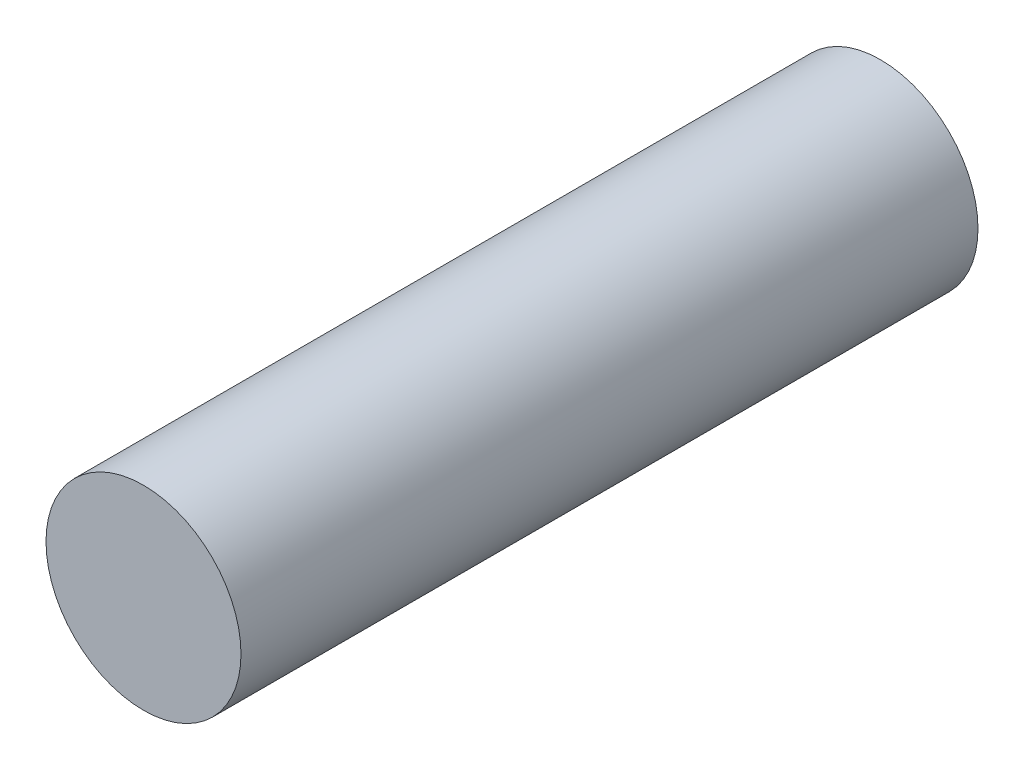
ISO-10303-21;
HEADER;
FILE_DESCRIPTION(('STEP AP214'),'2;1');
FILE_NAME('part.step','',(''),(''),'','','');
FILE_SCHEMA(('AUTOMOTIVE_DESIGN { 1 0 10303 214 1 1 1 1 }'));
ENDSEC;
DATA;
#1=APPLICATION_CONTEXT('core data for automotive mechanical design processes');
#2=APPLICATION_PROTOCOL_DEFINITION('international standard','automotive_design',2000,#1);
#3=PRODUCT_CONTEXT('',#1,'mechanical');
#4=PRODUCT('Part','Part','',(#3));
#5=PRODUCT_RELATED_PRODUCT_CATEGORY('part','',(#4));
#6=PRODUCT_DEFINITION_FORMATION('','',#4);
#7=PRODUCT_DEFINITION_CONTEXT('part definition',#1,'design');
#8=PRODUCT_DEFINITION('design','',#6,#7);
#9=PRODUCT_DEFINITION_SHAPE('','',#8);
#10=(LENGTH_UNIT() NAMED_UNIT(*) SI_UNIT(.MILLI.,.METRE.));
#11=(NAMED_UNIT(*) PLANE_ANGLE_UNIT() SI_UNIT($,.RADIAN.));
#12=(NAMED_UNIT(*) SI_UNIT($,.STERADIAN.) SOLID_ANGLE_UNIT());
#13=UNCERTAINTY_MEASURE_WITH_UNIT(LENGTH_MEASURE(1.E-05),#10,'distance_accuracy_value','');
#14=(GEOMETRIC_REPRESENTATION_CONTEXT(3) GLOBAL_UNCERTAINTY_ASSIGNED_CONTEXT((#13)) GLOBAL_UNIT_ASSIGNED_CONTEXT((#10,
#11,#12)) REPRESENTATION_CONTEXT('',''));
#15=CARTESIAN_POINT('',(0.,0.,0.));
#16=DIRECTION('',(0.,0.,1.));
#17=DIRECTION('',(1.,0.,0.));
#18=AXIS2_PLACEMENT_3D('',#15,#16,#17);
#19=CARTESIAN_POINT('',(0.,0.,12.));
#20=DIRECTION('',(0.,0.,-1.));
#21=DIRECTION('',(-1.,0.,0.));
#22=AXIS2_PLACEMENT_3D('',#19,#20,#21);
#23=CYLINDRICAL_SURFACE('',#22,3.175);
#24=CARTESIAN_POINT('',(0.,0.,12.));
#25=DIRECTION('',(0.,0.,1.));
#26=DIRECTION('',(1.,0.,0.));
#27=AXIS2_PLACEMENT_3D('',#24,#25,#26);
#28=CIRCLE('',#27,3.175);
#29=CARTESIAN_POINT('',(3.175,0.,12.));
#30=VERTEX_POINT('',#29);
#31=EDGE_CURVE('E10',#30,#30,#28,.T.);
#32=ORIENTED_EDGE('',*,*,#31,.F.);
#33=EDGE_LOOP('',(#32));
#34=FACE_BOUND('',#33,.T.);
#35=CARTESIAN_POINT('',(0.,0.,-12.));
#36=DIRECTION('',(0.,0.,1.));
#37=DIRECTION('',(1.,0.,0.));
#38=AXIS2_PLACEMENT_3D('',#35,#36,#37);
#39=CIRCLE('',#38,3.175);
#40=CARTESIAN_POINT('',(3.175,0.,-12.));
#41=VERTEX_POINT('',#40);
#42=EDGE_CURVE('E40',#41,#41,#39,.T.);
#43=ORIENTED_EDGE('',*,*,#42,.T.);
#44=EDGE_LOOP('',(#43));
#45=FACE_BOUND('',#44,.T.);
#46=ADVANCED_FACE('F37',(#34,#45),#23,.T.);
#47=CARTESIAN_POINT('',(0.,0.,12.));
#48=DIRECTION('',(0.,0.,1.));
#49=DIRECTION('',(1.,0.,0.));
#50=AXIS2_PLACEMENT_3D('',#47,#48,#49);
#51=PLANE('',#50);
#52=ORIENTED_EDGE('',*,*,#31,.T.);
#53=EDGE_LOOP('',(#52));
#54=FACE_BOUND('',#53,.T.);
#55=ADVANCED_FACE('F54',(#54),#51,.T.);
#56=CARTESIAN_POINT('',(0.,0.,-12.));
#57=DIRECTION('',(0.,0.,1.));
#58=DIRECTION('',(1.,0.,0.));
#59=AXIS2_PLACEMENT_3D('',#56,#57,#58);
#60=PLANE('',#59);
#61=ORIENTED_EDGE('',*,*,#42,.F.);
#62=EDGE_LOOP('',(#61));
#63=FACE_BOUND('',#62,.T.);
#64=ADVANCED_FACE('F52',(#63),#60,.F.);
#65=CLOSED_SHELL('',(#46,#55,#64));
#66=MANIFOLD_SOLID_BREP('B2',#65);
#67=ADVANCED_BREP_SHAPE_REPRESENTATION('',(#18,#66),#14);
#68=SHAPE_DEFINITION_REPRESENTATION(#9,#67);
ENDSEC;
END-ISO-10303-21;
